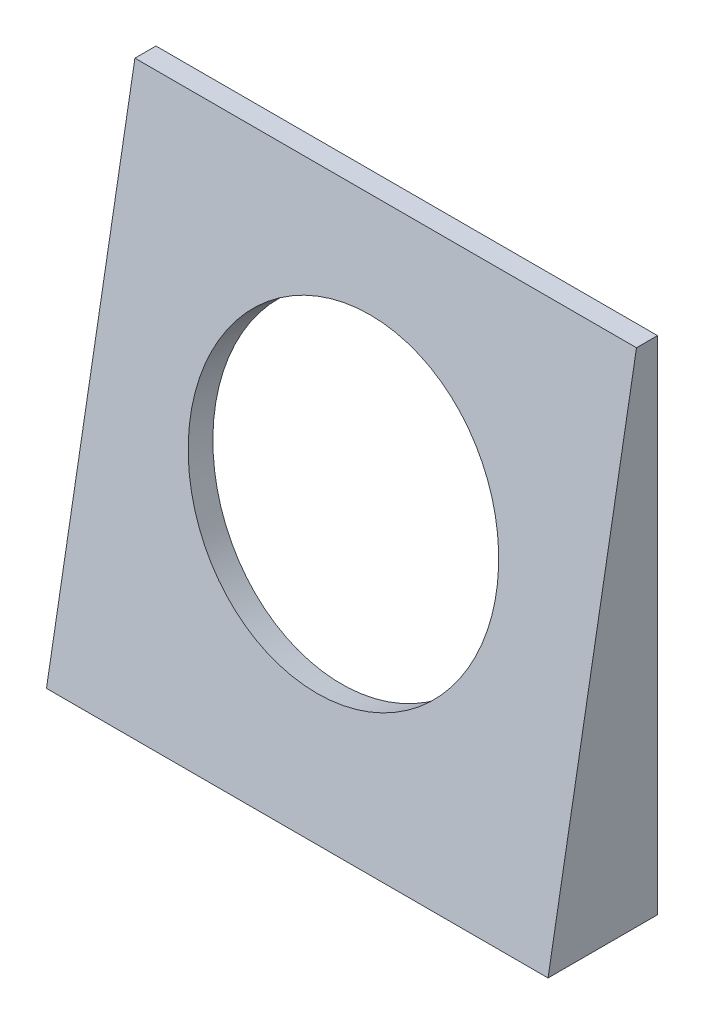
ISO-10303-21;
HEADER;
FILE_DESCRIPTION(('STEP AP214'),'2;1');
FILE_NAME('part.step','',(''),(''),'','','');
FILE_SCHEMA(('AUTOMOTIVE_DESIGN { 1 0 10303 214 1 1 1 1 }'));
ENDSEC;
DATA;
#1=APPLICATION_CONTEXT('core data for automotive mechanical design processes');
#2=APPLICATION_PROTOCOL_DEFINITION('international standard','automotive_design',2000,#1);
#3=PRODUCT_CONTEXT('',#1,'mechanical');
#4=PRODUCT('Part','Part','',(#3));
#5=PRODUCT_RELATED_PRODUCT_CATEGORY('part','',(#4));
#6=PRODUCT_DEFINITION_FORMATION('','',#4);
#7=PRODUCT_DEFINITION_CONTEXT('part definition',#1,'design');
#8=PRODUCT_DEFINITION('design','',#6,#7);
#9=PRODUCT_DEFINITION_SHAPE('','',#8);
#10=(LENGTH_UNIT() NAMED_UNIT(*) SI_UNIT(.MILLI.,.METRE.));
#11=(NAMED_UNIT(*) PLANE_ANGLE_UNIT() SI_UNIT($,.RADIAN.));
#12=(NAMED_UNIT(*) SI_UNIT($,.STERADIAN.) SOLID_ANGLE_UNIT());
#13=UNCERTAINTY_MEASURE_WITH_UNIT(LENGTH_MEASURE(1.E-05),#10,'distance_accuracy_value','');
#14=(GEOMETRIC_REPRESENTATION_CONTEXT(3) GLOBAL_UNCERTAINTY_ASSIGNED_CONTEXT((#13)) GLOBAL_UNIT_ASSIGNED_CONTEXT((#10,
#11,#12)) REPRESENTATION_CONTEXT('',''));
#15=CARTESIAN_POINT('',(0.,0.,0.));
#16=DIRECTION('',(0.,0.,1.));
#17=DIRECTION('',(1.,0.,0.));
#18=AXIS2_PLACEMENT_3D('',#15,#16,#17);
#19=CARTESIAN_POINT('',(10.,-10.,10.));
#20=DIRECTION('',(-1.,0.,0.));
#21=DIRECTION('',(0.,0.,1.));
#22=AXIS2_PLACEMENT_3D('',#19,#20,#21);
#23=PLANE('',#22);
#24=DIRECTION('',(0.,0.984807753012209,-0.173648177666924));
#25=VECTOR('',#24,1.);
#26=CARTESIAN_POINT('',(10.,-10.9635324364275,4.53553601067637));
#27=LINE('',#26,#25);
#28=CARTESIAN_POINT('',(9.99999999999999,-10.,4.36563924534644));
#29=VERTEX_POINT('',#28);
#30=CARTESIAN_POINT('',(10.,10.,0.839099631177287));
#31=VERTEX_POINT('',#30);
#32=EDGE_CURVE('E105',#29,#31,#27,.T.);
#33=ORIENTED_EDGE('',*,*,#32,.F.);
#34=DIRECTION('',(0.,0.,-1.));
#35=VECTOR('',#34,1.);
#36=CARTESIAN_POINT('',(10.,-10.,10.));
#37=LINE('',#36,#35);
#38=CARTESIAN_POINT('',(10.,-10.,0.));
#39=VERTEX_POINT('',#38);
#40=EDGE_CURVE('E92',#29,#39,#37,.T.);
#41=ORIENTED_EDGE('',*,*,#40,.T.);
#42=DIRECTION('',(0.,1.,0.));
#43=VECTOR('',#42,1.);
#44=CARTESIAN_POINT('',(10.,-10.,0.));
#45=LINE('',#44,#43);
#46=CARTESIAN_POINT('',(10.,10.,0.));
#47=VERTEX_POINT('',#46);
#48=EDGE_CURVE('E137',#39,#47,#45,.T.);
#49=ORIENTED_EDGE('',*,*,#48,.T.);
#50=DIRECTION('',(0.,0.,-1.));
#51=VECTOR('',#50,1.);
#52=CARTESIAN_POINT('',(10.,10.,10.));
#53=LINE('',#52,#51);
#54=EDGE_CURVE('E41',#31,#47,#53,.T.);
#55=ORIENTED_EDGE('',*,*,#54,.F.);
#56=EDGE_LOOP('',(#33,#41,#49,#55));
#57=FACE_BOUND('',#56,.T.);
#58=ADVANCED_FACE('F33',(#57),#23,.F.);
#59=CARTESIAN_POINT('',(-10.,10.,10.));
#60=DIRECTION('',(0.,-1.,0.));
#61=DIRECTION('',(0.,0.,-1.));
#62=AXIS2_PLACEMENT_3D('',#59,#60,#61);
#63=PLANE('',#62);
#64=DIRECTION('',(1.,0.,0.));
#65=VECTOR('',#64,1.);
#66=CARTESIAN_POINT('',(-71.25,10.,0.839099631177287));
#67=LINE('',#66,#65);
#68=CARTESIAN_POINT('',(-10.,10.,0.839099631177287));
#69=VERTEX_POINT('',#68);
#70=EDGE_CURVE('E48',#69,#31,#67,.T.);
#71=ORIENTED_EDGE('',*,*,#70,.T.);
#72=ORIENTED_EDGE('',*,*,#54,.T.);
#73=DIRECTION('',(-1.,0.,0.));
#74=VECTOR('',#73,1.);
#75=CARTESIAN_POINT('',(-10.,10.,0.));
#76=LINE('',#75,#74);
#77=CARTESIAN_POINT('',(-10.,10.,0.));
#78=VERTEX_POINT('',#77);
#79=EDGE_CURVE('E139',#47,#78,#76,.T.);
#80=ORIENTED_EDGE('',*,*,#79,.T.);
#81=DIRECTION('',(0.,0.,-1.));
#82=VECTOR('',#81,1.);
#83=CARTESIAN_POINT('',(-10.,10.,10.));
#84=LINE('',#83,#82);
#85=EDGE_CURVE('E147',#69,#78,#84,.T.);
#86=ORIENTED_EDGE('',*,*,#85,.F.);
#87=EDGE_LOOP('',(#71,#72,#80,#86));
#88=FACE_BOUND('',#87,.T.);
#89=ADVANCED_FACE('F149',(#88),#63,.F.);
#90=CARTESIAN_POINT('',(-10.,-10.,10.));
#91=DIRECTION('',(1.,0.,0.));
#92=DIRECTION('',(0.,0.,-1.));
#93=AXIS2_PLACEMENT_3D('',#90,#91,#92);
#94=PLANE('',#93);
#95=DIRECTION('',(0.,-0.984807753012209,0.173648177666924));
#96=VECTOR('',#95,1.);
#97=CARTESIAN_POINT('',(-10.,-10.9635324364275,4.53553601067637));
#98=LINE('',#97,#96);
#99=CARTESIAN_POINT('',(-10.,-10.,4.36563924534644));
#100=VERTEX_POINT('',#99);
#101=EDGE_CURVE('E56',#69,#100,#98,.T.);
#102=ORIENTED_EDGE('',*,*,#101,.F.);
#103=ORIENTED_EDGE('',*,*,#85,.T.);
#104=DIRECTION('',(0.,-1.,0.));
#105=VECTOR('',#104,1.);
#106=CARTESIAN_POINT('',(-10.,-10.,0.));
#107=LINE('',#106,#105);
#108=CARTESIAN_POINT('',(-10.,-10.,0.));
#109=VERTEX_POINT('',#108);
#110=EDGE_CURVE('E142',#78,#109,#107,.T.);
#111=ORIENTED_EDGE('',*,*,#110,.T.);
#112=DIRECTION('',(0.,0.,-1.));
#113=VECTOR('',#112,1.);
#114=CARTESIAN_POINT('',(-10.,-10.,10.));
#115=LINE('',#114,#113);
#116=EDGE_CURVE('E102',#100,#109,#115,.T.);
#117=ORIENTED_EDGE('',*,*,#116,.F.);
#118=EDGE_LOOP('',(#102,#103,#111,#117));
#119=FACE_BOUND('',#118,.T.);
#120=ADVANCED_FACE('F154',(#119),#94,.F.);
#121=CARTESIAN_POINT('',(-10.,-10.,10.));
#122=DIRECTION('',(0.,1.,0.));
#123=DIRECTION('',(0.,0.,1.));
#124=AXIS2_PLACEMENT_3D('',#121,#122,#123);
#125=PLANE('',#124);
#126=DIRECTION('',(1.,0.,0.));
#127=VECTOR('',#126,1.);
#128=CARTESIAN_POINT('',(-71.25,-10.,4.36563924534644));
#129=LINE('',#128,#127);
#130=EDGE_CURVE('E96',#100,#29,#129,.T.);
#131=ORIENTED_EDGE('',*,*,#130,.F.);
#132=ORIENTED_EDGE('',*,*,#116,.T.);
#133=DIRECTION('',(1.,0.,0.));
#134=VECTOR('',#133,1.);
#135=CARTESIAN_POINT('',(-10.,-10.,0.));
#136=LINE('',#135,#134);
#137=EDGE_CURVE('E98',#109,#39,#136,.T.);
#138=ORIENTED_EDGE('',*,*,#137,.T.);
#139=ORIENTED_EDGE('',*,*,#40,.F.);
#140=EDGE_LOOP('',(#131,#132,#138,#139));
#141=FACE_BOUND('',#140,.T.);
#142=ADVANCED_FACE('F94',(#141),#125,.F.);
#143=CARTESIAN_POINT('',(9.00000000000001,-9.00000000000001,10.));
#144=DIRECTION('',(-1.,0.,0.));
#145=DIRECTION('',(0.,0.,1.));
#146=AXIS2_PLACEMENT_3D('',#143,#144,#145);
#147=PLANE('',#146);
#148=DIRECTION('',(0.,-0.984807753012209,0.173648177666923));
#149=VECTOR('',#148,1.);
#150=CARTESIAN_POINT('',(9.00000000000001,-10.1673343037015,3.37971818600134));
#151=LINE('',#150,#149);
#152=CARTESIAN_POINT('',(9.00000000000001,8.99999999999999,0.));
#153=VERTEX_POINT('',#152);
#154=CARTESIAN_POINT('',(9.00000000000001,-9.00000000000001,3.17388565275224));
#155=VERTEX_POINT('',#154);
#156=EDGE_CURVE('E118',#153,#155,#151,.T.);
#157=ORIENTED_EDGE('',*,*,#156,.F.);
#158=DIRECTION('',(0.,1.,0.));
#159=VECTOR('',#158,1.);
#160=CARTESIAN_POINT('',(9.00000000000001,-9.00000000000001,0.));
#161=LINE('',#160,#159);
#162=CARTESIAN_POINT('',(9.00000000000001,-9.00000000000001,0.));
#163=VERTEX_POINT('',#162);
#164=EDGE_CURVE('E121',#163,#153,#161,.T.);
#165=ORIENTED_EDGE('',*,*,#164,.F.);
#166=DIRECTION('',(0.,0.,-1.));
#167=VECTOR('',#166,1.);
#168=CARTESIAN_POINT('',(9.00000000000001,-9.00000000000001,10.));
#169=LINE('',#168,#167);
#170=EDGE_CURVE('E133',#155,#163,#169,.T.);
#171=ORIENTED_EDGE('',*,*,#170,.F.);
#172=EDGE_LOOP('',(#157,#165,#171));
#173=FACE_BOUND('',#172,.T.);
#174=ADVANCED_FACE('F161',(#173),#147,.T.);
#175=CARTESIAN_POINT('',(-8.99999999999999,-9.00000000000001,10.));
#176=DIRECTION('',(1.,0.,0.));
#177=DIRECTION('',(0.,0.,-1.));
#178=AXIS2_PLACEMENT_3D('',#175,#176,#177);
#179=PLANE('',#178);
#180=DIRECTION('',(0.,0.984807753012209,-0.173648177666923));
#181=VECTOR('',#180,1.);
#182=CARTESIAN_POINT('',(-8.99999999999999,-10.1673343037015,3.37971818600134));
#183=LINE('',#182,#181);
#184=CARTESIAN_POINT('',(-8.99999999999999,-9.00000000000001,3.17388565275224));
#185=VERTEX_POINT('',#184);
#186=CARTESIAN_POINT('',(-8.99999999999999,8.99999999999999,0.));
#187=VERTEX_POINT('',#186);
#188=EDGE_CURVE('E107',#185,#187,#183,.T.);
#189=ORIENTED_EDGE('',*,*,#188,.F.);
#190=DIRECTION('',(0.,0.,-1.));
#191=VECTOR('',#190,1.);
#192=CARTESIAN_POINT('',(-8.99999999999999,-9.00000000000001,10.));
#193=LINE('',#192,#191);
#194=CARTESIAN_POINT('',(-8.99999999999999,-9.00000000000001,0.));
#195=VERTEX_POINT('',#194);
#196=EDGE_CURVE('E135',#185,#195,#193,.T.);
#197=ORIENTED_EDGE('',*,*,#196,.T.);
#198=DIRECTION('',(0.,-1.,0.));
#199=VECTOR('',#198,1.);
#200=CARTESIAN_POINT('',(-8.99999999999999,-9.00000000000001,0.));
#201=LINE('',#200,#199);
#202=EDGE_CURVE('E127',#187,#195,#201,.T.);
#203=ORIENTED_EDGE('',*,*,#202,.F.);
#204=EDGE_LOOP('',(#189,#197,#203));
#205=FACE_BOUND('',#204,.T.);
#206=ADVANCED_FACE('F223',(#205),#179,.T.);
#207=CARTESIAN_POINT('',(-8.99999999999999,-9.00000000000001,10.));
#208=DIRECTION('',(0.,1.,0.));
#209=DIRECTION('',(0.,0.,1.));
#210=AXIS2_PLACEMENT_3D('',#207,#208,#209);
#211=PLANE('',#210);
#212=DIRECTION('',(-1.,0.,0.));
#213=VECTOR('',#212,1.);
#214=CARTESIAN_POINT('',(-8.99999999999999,-9.00000000000001,3.17388565275224));
#215=LINE('',#214,#213);
#216=EDGE_CURVE('E11',#155,#185,#215,.T.);
#217=ORIENTED_EDGE('',*,*,#216,.F.);
#218=ORIENTED_EDGE('',*,*,#170,.T.);
#219=DIRECTION('',(1.,0.,0.));
#220=VECTOR('',#219,1.);
#221=CARTESIAN_POINT('',(-8.99999999999999,-9.00000000000001,0.));
#222=LINE('',#221,#220);
#223=EDGE_CURVE('E130',#195,#163,#222,.T.);
#224=ORIENTED_EDGE('',*,*,#223,.F.);
#225=ORIENTED_EDGE('',*,*,#196,.F.);
#226=EDGE_LOOP('',(#217,#218,#224,#225));
#227=FACE_BOUND('',#226,.T.);
#228=ADVANCED_FACE('F220',(#227),#211,.T.);
#229=CARTESIAN_POINT('',(0.,0.,0.));
#230=DIRECTION('',(0.,0.,-1.));
#231=DIRECTION('',(-1.,0.,0.));
#232=AXIS2_PLACEMENT_3D('',#229,#230,#231);
#233=PLANE('',#232);
#234=ORIENTED_EDGE('',*,*,#164,.T.);
#235=DIRECTION('',(-1.,0.,0.));
#236=VECTOR('',#235,1.);
#237=CARTESIAN_POINT('',(-8.99999999999999,8.99999999999999,0.));
#238=LINE('',#237,#236);
#239=EDGE_CURVE('E124',#153,#187,#238,.T.);
#240=ORIENTED_EDGE('',*,*,#239,.T.);
#241=ORIENTED_EDGE('',*,*,#202,.T.);
#242=ORIENTED_EDGE('',*,*,#223,.T.);
#243=EDGE_LOOP('',(#234,#240,#241,#242));
#244=FACE_BOUND('',#243,.T.);
#245=ORIENTED_EDGE('',*,*,#79,.F.);
#246=ORIENTED_EDGE('',*,*,#48,.F.);
#247=ORIENTED_EDGE('',*,*,#137,.F.);
#248=ORIENTED_EDGE('',*,*,#110,.F.);
#249=EDGE_LOOP('',(#245,#246,#247,#248));
#250=FACE_BOUND('',#249,.T.);
#251=ADVANCED_FACE('F153',(#244,#250),#233,.T.);
#252=CARTESIAN_POINT('',(-10.,8.99999999999999,0.));
#253=DIRECTION('',(0.,-0.173648177666923,-0.984807753012209));
#254=DIRECTION('',(0.,0.984807753012209,-0.173648177666923));
#255=AXIS2_PLACEMENT_3D('',#252,#253,#254);
#256=PLANE('',#255);
#257=CARTESIAN_POINT('',(0.,0.27138320646339,1.53909064496545));
#258=DIRECTION('',(0.,-0.173648177666923,-0.984807753012209));
#259=DIRECTION('',(0.,0.984807753012209,-0.173648177666923));
#260=AXIS2_PLACEMENT_3D('',#257,#258,#259);
#261=CIRCLE('',#260,6.1);
#262=CARTESIAN_POINT('',(0.,6.27871049983787,0.479836761197216));
#263=VERTEX_POINT('',#262);
#264=EDGE_CURVE('E114',#263,#263,#261,.T.);
#265=ORIENTED_EDGE('',*,*,#264,.F.);
#266=EDGE_LOOP('',(#265));
#267=FACE_BOUND('',#266,.T.);
#268=ORIENTED_EDGE('',*,*,#239,.F.);
#269=ORIENTED_EDGE('',*,*,#156,.T.);
#270=ORIENTED_EDGE('',*,*,#216,.T.);
#271=ORIENTED_EDGE('',*,*,#188,.T.);
#272=EDGE_LOOP('',(#268,#269,#270,#271));
#273=FACE_BOUND('',#272,.T.);
#274=ADVANCED_FACE('F188',(#267,#273),#256,.T.);
#275=CARTESIAN_POINT('',(-10.,-10.,4.36563924534644));
#276=DIRECTION('',(0.,0.173648177666923,0.984807753012209));
#277=DIRECTION('',(0.,-0.984807753012209,0.173648177666923));
#278=AXIS2_PLACEMENT_3D('',#275,#276,#277);
#279=PLANE('',#278);
#280=CARTESIAN_POINT('',(0.,0.445031384130314,2.52389839797766));
#281=DIRECTION('',(0.,0.173648177666923,0.984807753012209));
#282=DIRECTION('',(0.,-0.984807753012209,0.173648177666923));
#283=AXIS2_PLACEMENT_3D('',#280,#281,#282);
#284=CIRCLE('',#283,6.1);
#285=CARTESIAN_POINT('',(0.,-5.56229590924416,3.58315228174589));
#286=VERTEX_POINT('',#285);
#287=EDGE_CURVE('E36',#286,#286,#284,.T.);
#288=ORIENTED_EDGE('',*,*,#287,.F.);
#289=EDGE_LOOP('',(#288));
#290=FACE_BOUND('',#289,.T.);
#291=ORIENTED_EDGE('',*,*,#130,.T.);
#292=ORIENTED_EDGE('',*,*,#32,.T.);
#293=ORIENTED_EDGE('',*,*,#70,.F.);
#294=ORIENTED_EDGE('',*,*,#101,.T.);
#295=EDGE_LOOP('',(#291,#292,#293,#294));
#296=FACE_BOUND('',#295,.T.);
#297=ADVANCED_FACE('F109',(#290,#296),#279,.T.);
#298=CARTESIAN_POINT('',(0.,2.00786498313263,11.3871681750875));
#299=DIRECTION('',(0.,-0.173648177666923,-0.984807753012209));
#300=DIRECTION('',(0.,0.984807753012209,-0.173648177666923));
#301=AXIS2_PLACEMENT_3D('',#298,#299,#300);
#302=CYLINDRICAL_SURFACE('',#301,6.1);
#303=ORIENTED_EDGE('',*,*,#287,.T.);
#304=EDGE_LOOP('',(#303));
#305=FACE_BOUND('',#304,.T.);
#306=ORIENTED_EDGE('',*,*,#264,.T.);
#307=EDGE_LOOP('',(#306));
#308=FACE_BOUND('',#307,.T.);
#309=ADVANCED_FACE('F203',(#305,#308),#302,.F.);
#310=CLOSED_SHELL('',(#58,#89,#120,#142,#174,#206,#228,#251,#274,#297,#309));
#311=MANIFOLD_SOLID_BREP('B2',#310);
#312=ADVANCED_BREP_SHAPE_REPRESENTATION('',(#18,#311),#14);
#313=SHAPE_DEFINITION_REPRESENTATION(#9,#312);
ENDSEC;
END-ISO-10303-21;
